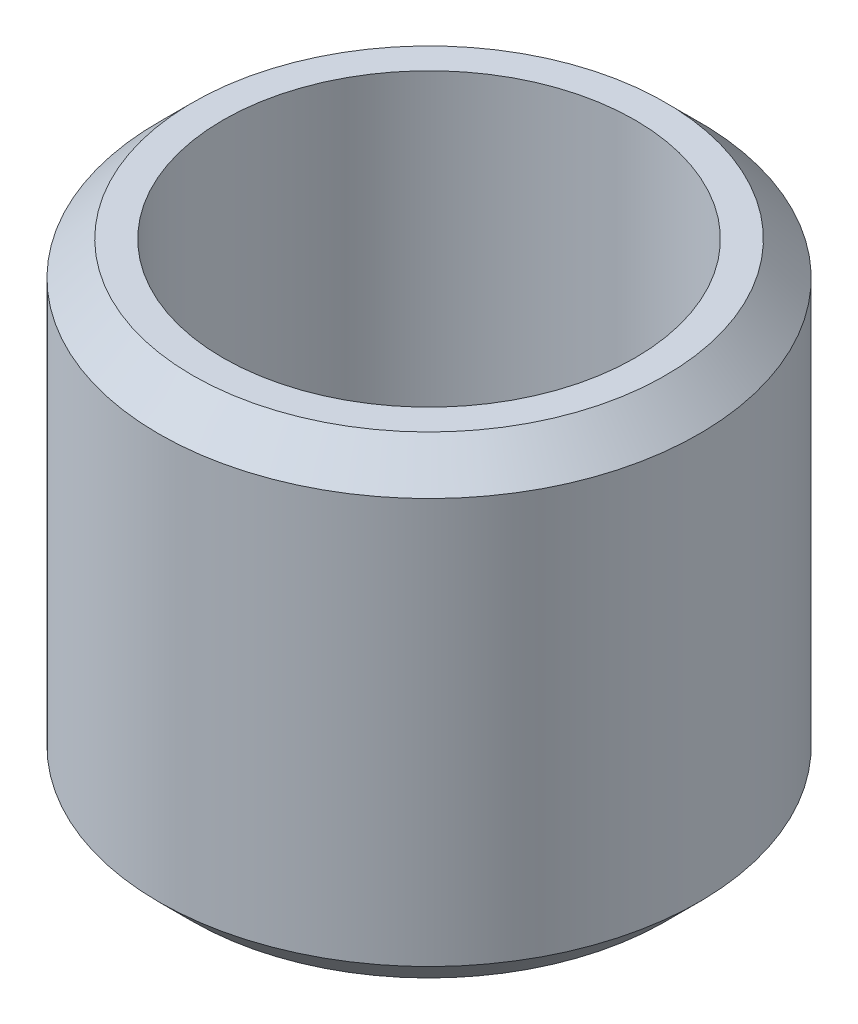
ISO-10303-21;
HEADER;
FILE_DESCRIPTION(('STEP AP214'),'2;1');
FILE_NAME('part.step','',(''),(''),'','','');
FILE_SCHEMA(('AUTOMOTIVE_DESIGN { 1 0 10303 214 1 1 1 1 }'));
ENDSEC;
DATA;
#1=APPLICATION_CONTEXT('core data for automotive mechanical design processes');
#2=APPLICATION_PROTOCOL_DEFINITION('international standard','automotive_design',2000,#1);
#3=PRODUCT_CONTEXT('',#1,'mechanical');
#4=PRODUCT('Part','Part','',(#3));
#5=PRODUCT_RELATED_PRODUCT_CATEGORY('part','',(#4));
#6=PRODUCT_DEFINITION_FORMATION('','',#4);
#7=PRODUCT_DEFINITION_CONTEXT('part definition',#1,'design');
#8=PRODUCT_DEFINITION('design','',#6,#7);
#9=PRODUCT_DEFINITION_SHAPE('','',#8);
#10=(LENGTH_UNIT() NAMED_UNIT(*) SI_UNIT(.MILLI.,.METRE.));
#11=(NAMED_UNIT(*) PLANE_ANGLE_UNIT() SI_UNIT($,.RADIAN.));
#12=(NAMED_UNIT(*) SI_UNIT($,.STERADIAN.) SOLID_ANGLE_UNIT());
#13=UNCERTAINTY_MEASURE_WITH_UNIT(LENGTH_MEASURE(1.E-05),#10,'distance_accuracy_value','');
#14=(GEOMETRIC_REPRESENTATION_CONTEXT(3) GLOBAL_UNCERTAINTY_ASSIGNED_CONTEXT((#13)) GLOBAL_UNIT_ASSIGNED_CONTEXT((#10,
#11,#12)) REPRESENTATION_CONTEXT('',''));
#15=CARTESIAN_POINT('',(0.,0.,0.));
#16=DIRECTION('',(0.,0.,1.));
#17=DIRECTION('',(1.,0.,0.));
#18=AXIS2_PLACEMENT_3D('',#15,#16,#17);
#19=CARTESIAN_POINT('',(0.,7.,0.));
#20=DIRECTION('',(0.,-1.,0.));
#21=DIRECTION('',(0.,0.,-1.));
#22=AXIS2_PLACEMENT_3D('',#19,#20,#21);
#23=CYLINDRICAL_SURFACE('',#22,4.);
#24=CARTESIAN_POINT('',(0.,6.5,0.));
#25=DIRECTION('',(0.,1.,0.));
#26=DIRECTION('',(0.,0.,1.));
#27=AXIS2_PLACEMENT_3D('',#24,#25,#26);
#28=CIRCLE('',#27,4.);
#29=CARTESIAN_POINT('',(0.,6.5,4.));
#30=VERTEX_POINT('',#29);
#31=EDGE_CURVE('E38',#30,#30,#28,.F.);
#32=ORIENTED_EDGE('',*,*,#31,.T.);
#33=EDGE_LOOP('',(#32));
#34=FACE_BOUND('',#33,.T.);
#35=CARTESIAN_POINT('',(0.,0.5,0.));
#36=DIRECTION('',(0.,1.,0.));
#37=DIRECTION('',(0.,0.,1.));
#38=AXIS2_PLACEMENT_3D('',#35,#36,#37);
#39=CIRCLE('',#38,4.);
#40=CARTESIAN_POINT('',(0.,0.5,4.));
#41=VERTEX_POINT('',#40);
#42=EDGE_CURVE('E42',#41,#41,#39,.T.);
#43=ORIENTED_EDGE('',*,*,#42,.T.);
#44=EDGE_LOOP('',(#43));
#45=FACE_BOUND('',#44,.T.);
#46=ADVANCED_FACE('F31',(#34,#45),#23,.T.);
#47=CARTESIAN_POINT('',(0.,7.,0.));
#48=DIRECTION('',(0.,1.,0.));
#49=DIRECTION('',(0.,0.,1.));
#50=AXIS2_PLACEMENT_3D('',#47,#48,#49);
#51=PLANE('',#50);
#52=CARTESIAN_POINT('',(0.,7.,0.));
#53=DIRECTION('',(0.,1.,0.));
#54=DIRECTION('',(0.,0.,1.));
#55=AXIS2_PLACEMENT_3D('',#52,#53,#54);
#56=CIRCLE('',#55,3.5);
#57=CARTESIAN_POINT('',(0.,7.,3.5));
#58=VERTEX_POINT('',#57);
#59=EDGE_CURVE('E46',#58,#58,#56,.T.);
#60=ORIENTED_EDGE('',*,*,#59,.T.);
#61=EDGE_LOOP('',(#60));
#62=FACE_BOUND('',#61,.T.);
#63=CARTESIAN_POINT('',(0.,7.,0.));
#64=DIRECTION('',(0.,1.,0.));
#65=DIRECTION('',(0.,0.,1.));
#66=AXIS2_PLACEMENT_3D('',#63,#64,#65);
#67=CIRCLE('',#66,3.05);
#68=CARTESIAN_POINT('',(0.,7.,3.05));
#69=VERTEX_POINT('',#68);
#70=EDGE_CURVE('E52',#69,#69,#67,.T.);
#71=ORIENTED_EDGE('',*,*,#70,.F.);
#72=EDGE_LOOP('',(#71));
#73=FACE_BOUND('',#72,.T.);
#74=ADVANCED_FACE('F67',(#62,#73),#51,.T.);
#75=CARTESIAN_POINT('',(0.,0.,0.));
#76=DIRECTION('',(0.,1.,0.));
#77=DIRECTION('',(0.,0.,1.));
#78=AXIS2_PLACEMENT_3D('',#75,#76,#77);
#79=PLANE('',#78);
#80=CARTESIAN_POINT('',(0.,0.,0.));
#81=DIRECTION('',(0.,1.,0.));
#82=DIRECTION('',(0.,0.,1.));
#83=AXIS2_PLACEMENT_3D('',#80,#81,#82);
#84=CIRCLE('',#83,3.5);
#85=CARTESIAN_POINT('',(0.,0.,3.5));
#86=VERTEX_POINT('',#85);
#87=EDGE_CURVE('E10',#86,#86,#84,.F.);
#88=ORIENTED_EDGE('',*,*,#87,.T.);
#89=EDGE_LOOP('',(#88));
#90=FACE_BOUND('',#89,.T.);
#91=ADVANCED_FACE('F63',(#90),#79,.F.);
#92=CARTESIAN_POINT('',(0.,1.,0.));
#93=DIRECTION('',(0.,1.,0.));
#94=DIRECTION('',(0.,0.,1.));
#95=AXIS2_PLACEMENT_3D('',#92,#93,#94);
#96=CYLINDRICAL_SURFACE('',#95,3.05);
#97=CARTESIAN_POINT('',(0.,1.,0.));
#98=DIRECTION('',(0.,1.,0.));
#99=DIRECTION('',(0.,0.,1.));
#100=AXIS2_PLACEMENT_3D('',#97,#98,#99);
#101=CIRCLE('',#100,3.05);
#102=CARTESIAN_POINT('',(0.,1.,3.05));
#103=VERTEX_POINT('',#102);
#104=EDGE_CURVE('E51',#103,#103,#101,.T.);
#105=ORIENTED_EDGE('',*,*,#104,.F.);
#106=EDGE_LOOP('',(#105));
#107=FACE_BOUND('',#106,.T.);
#108=ORIENTED_EDGE('',*,*,#70,.T.);
#109=EDGE_LOOP('',(#108));
#110=FACE_BOUND('',#109,.T.);
#111=ADVANCED_FACE('F60',(#107,#110),#96,.F.);
#112=CARTESIAN_POINT('',(0.,1.,0.));
#113=DIRECTION('',(0.,1.,0.));
#114=DIRECTION('',(0.,0.,1.));
#115=AXIS2_PLACEMENT_3D('',#112,#113,#114);
#116=PLANE('',#115);
#117=ORIENTED_EDGE('',*,*,#104,.T.);
#118=EDGE_LOOP('',(#117));
#119=FACE_BOUND('',#118,.T.);
#120=ADVANCED_FACE('F58',(#119),#116,.T.);
#121=CARTESIAN_POINT('',(0.,7.,0.));
#122=DIRECTION('',(0.,-1.,0.));
#123=DIRECTION('',(0.,0.,-1.));
#124=AXIS2_PLACEMENT_3D('',#121,#122,#123);
#125=CONICAL_SURFACE('',#124,3.5,0.785398163397447);
#126=ORIENTED_EDGE('',*,*,#31,.F.);
#127=EDGE_LOOP('',(#126));
#128=FACE_BOUND('',#127,.T.);
#129=ORIENTED_EDGE('',*,*,#59,.F.);
#130=EDGE_LOOP('',(#129));
#131=FACE_BOUND('',#130,.T.);
#132=ADVANCED_FACE('F78',(#128,#131),#125,.T.);
#133=CARTESIAN_POINT('',(0.,0.5,0.));
#134=DIRECTION('',(0.,1.,0.));
#135=DIRECTION('',(0.,0.,1.));
#136=AXIS2_PLACEMENT_3D('',#133,#134,#135);
#137=CONICAL_SURFACE('',#136,4.,0.785398163397449);
#138=ORIENTED_EDGE('',*,*,#87,.F.);
#139=EDGE_LOOP('',(#138));
#140=FACE_BOUND('',#139,.T.);
#141=ORIENTED_EDGE('',*,*,#42,.F.);
#142=EDGE_LOOP('',(#141));
#143=FACE_BOUND('',#142,.T.);
#144=ADVANCED_FACE('F33',(#140,#143),#137,.T.);
#145=CLOSED_SHELL('',(#46,#74,#91,#111,#120,#132,#144));
#146=MANIFOLD_SOLID_BREP('B2',#145);
#147=ADVANCED_BREP_SHAPE_REPRESENTATION('',(#18,#146),#14);
#148=SHAPE_DEFINITION_REPRESENTATION(#9,#147);
ENDSEC;
END-ISO-10303-21;
